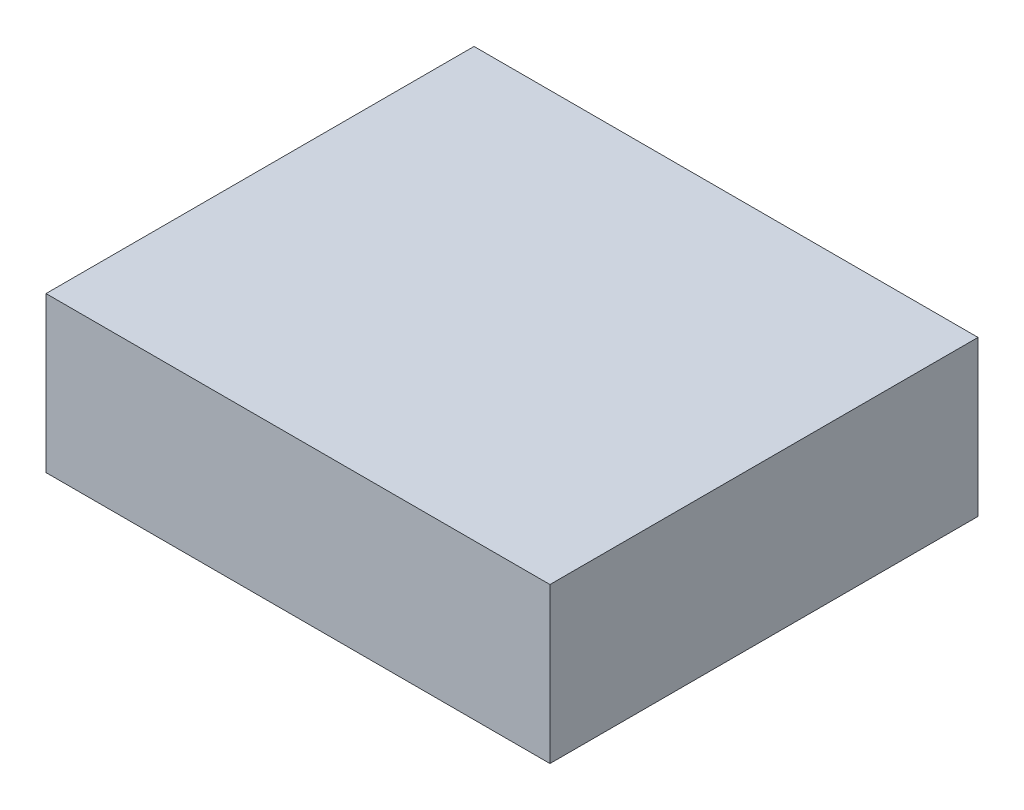
ISO-10303-21;
HEADER;
FILE_DESCRIPTION(('STEP AP214'),'2;1');
FILE_NAME('part.step','',(''),(''),'','','');
FILE_SCHEMA(('AUTOMOTIVE_DESIGN { 1 0 10303 214 1 1 1 1 }'));
ENDSEC;
DATA;
#1=APPLICATION_CONTEXT('core data for automotive mechanical design processes');
#2=APPLICATION_PROTOCOL_DEFINITION('international standard','automotive_design',2000,#1);
#3=PRODUCT_CONTEXT('',#1,'mechanical');
#4=PRODUCT('Part','Part','',(#3));
#5=PRODUCT_RELATED_PRODUCT_CATEGORY('part','',(#4));
#6=PRODUCT_DEFINITION_FORMATION('','',#4);
#7=PRODUCT_DEFINITION_CONTEXT('part definition',#1,'design');
#8=PRODUCT_DEFINITION('design','',#6,#7);
#9=PRODUCT_DEFINITION_SHAPE('','',#8);
#10=(LENGTH_UNIT() NAMED_UNIT(*) SI_UNIT(.MILLI.,.METRE.));
#11=(NAMED_UNIT(*) PLANE_ANGLE_UNIT() SI_UNIT($,.RADIAN.));
#12=(NAMED_UNIT(*) SI_UNIT($,.STERADIAN.) SOLID_ANGLE_UNIT());
#13=UNCERTAINTY_MEASURE_WITH_UNIT(LENGTH_MEASURE(1.E-05),#10,'distance_accuracy_value','');
#14=(GEOMETRIC_REPRESENTATION_CONTEXT(3) GLOBAL_UNCERTAINTY_ASSIGNED_CONTEXT((#13)) GLOBAL_UNIT_ASSIGNED_CONTEXT((#10,
#11,#12)) REPRESENTATION_CONTEXT('',''));
#15=CARTESIAN_POINT('',(0.,0.,0.));
#16=DIRECTION('',(0.,0.,1.));
#17=DIRECTION('',(1.,0.,0.));
#18=AXIS2_PLACEMENT_3D('',#15,#16,#17);
#19=CARTESIAN_POINT('',(156.,96.,132.5));
#20=DIRECTION('',(-1.,0.,0.));
#21=DIRECTION('',(0.,0.,1.));
#22=AXIS2_PLACEMENT_3D('',#19,#20,#21);
#23=PLANE('',#22);
#24=DIRECTION('',(0.,0.,-1.));
#25=VECTOR('',#24,1.);
#26=CARTESIAN_POINT('',(156.,0.,132.5));
#27=LINE('',#26,#25);
#28=CARTESIAN_POINT('',(156.,0.,132.5));
#29=VERTEX_POINT('',#28);
#30=CARTESIAN_POINT('',(156.,0.,-132.5));
#31=VERTEX_POINT('',#30);
#32=EDGE_CURVE('E101',#29,#31,#27,.T.);
#33=ORIENTED_EDGE('',*,*,#32,.T.);
#34=DIRECTION('',(0.,-1.,0.));
#35=VECTOR('',#34,1.);
#36=CARTESIAN_POINT('',(156.,96.,-132.5));
#37=LINE('',#36,#35);
#38=CARTESIAN_POINT('',(156.,96.,-132.5));
#39=VERTEX_POINT('',#38);
#40=EDGE_CURVE('E11',#39,#31,#37,.T.);
#41=ORIENTED_EDGE('',*,*,#40,.F.);
#42=DIRECTION('',(0.,0.,-1.));
#43=VECTOR('',#42,1.);
#44=CARTESIAN_POINT('',(156.,96.,132.5));
#45=LINE('',#44,#43);
#46=CARTESIAN_POINT('',(156.,96.,132.5));
#47=VERTEX_POINT('',#46);
#48=EDGE_CURVE('E89',#47,#39,#45,.T.);
#49=ORIENTED_EDGE('',*,*,#48,.F.);
#50=DIRECTION('',(0.,-1.,0.));
#51=VECTOR('',#50,1.);
#52=CARTESIAN_POINT('',(156.,96.,132.5));
#53=LINE('',#52,#51);
#54=EDGE_CURVE('E97',#47,#29,#53,.T.);
#55=ORIENTED_EDGE('',*,*,#54,.T.);
#56=EDGE_LOOP('',(#33,#41,#49,#55));
#57=FACE_BOUND('',#56,.T.);
#58=ADVANCED_FACE('F38',(#57),#23,.F.);
#59=CARTESIAN_POINT('',(-156.,96.,-132.5));
#60=DIRECTION('',(0.,0.,1.));
#61=DIRECTION('',(1.,0.,0.));
#62=AXIS2_PLACEMENT_3D('',#59,#60,#61);
#63=PLANE('',#62);
#64=DIRECTION('',(-1.,0.,0.));
#65=VECTOR('',#64,1.);
#66=CARTESIAN_POINT('',(-156.,0.,-132.5));
#67=LINE('',#66,#65);
#68=CARTESIAN_POINT('',(-156.,0.,-132.5));
#69=VERTEX_POINT('',#68);
#70=EDGE_CURVE('E93',#31,#69,#67,.T.);
#71=ORIENTED_EDGE('',*,*,#70,.T.);
#72=DIRECTION('',(0.,-1.,0.));
#73=VECTOR('',#72,1.);
#74=CARTESIAN_POINT('',(-156.,96.,-132.5));
#75=LINE('',#74,#73);
#76=CARTESIAN_POINT('',(-156.,96.,-132.5));
#77=VERTEX_POINT('',#76);
#78=EDGE_CURVE('E46',#77,#69,#75,.T.);
#79=ORIENTED_EDGE('',*,*,#78,.F.);
#80=DIRECTION('',(-1.,0.,0.));
#81=VECTOR('',#80,1.);
#82=CARTESIAN_POINT('',(-156.,96.,-132.5));
#83=LINE('',#82,#81);
#84=EDGE_CURVE('E84',#39,#77,#83,.T.);
#85=ORIENTED_EDGE('',*,*,#84,.F.);
#86=ORIENTED_EDGE('',*,*,#40,.T.);
#87=EDGE_LOOP('',(#71,#79,#85,#86));
#88=FACE_BOUND('',#87,.T.);
#89=ADVANCED_FACE('F92',(#88),#63,.F.);
#90=CARTESIAN_POINT('',(-156.,96.,132.5));
#91=DIRECTION('',(1.,0.,0.));
#92=DIRECTION('',(0.,0.,-1.));
#93=AXIS2_PLACEMENT_3D('',#90,#91,#92);
#94=PLANE('',#93);
#95=DIRECTION('',(0.,0.,1.));
#96=VECTOR('',#95,1.);
#97=CARTESIAN_POINT('',(-156.,0.,132.5));
#98=LINE('',#97,#96);
#99=CARTESIAN_POINT('',(-156.,0.,132.5));
#100=VERTEX_POINT('',#99);
#101=EDGE_CURVE('E71',#69,#100,#98,.T.);
#102=ORIENTED_EDGE('',*,*,#101,.T.);
#103=DIRECTION('',(0.,-1.,0.));
#104=VECTOR('',#103,1.);
#105=CARTESIAN_POINT('',(-156.,96.,132.5));
#106=LINE('',#105,#104);
#107=CARTESIAN_POINT('',(-156.,96.,132.5));
#108=VERTEX_POINT('',#107);
#109=EDGE_CURVE('E94',#108,#100,#106,.T.);
#110=ORIENTED_EDGE('',*,*,#109,.F.);
#111=DIRECTION('',(0.,0.,1.));
#112=VECTOR('',#111,1.);
#113=CARTESIAN_POINT('',(-156.,96.,132.5));
#114=LINE('',#113,#112);
#115=EDGE_CURVE('E87',#77,#108,#114,.T.);
#116=ORIENTED_EDGE('',*,*,#115,.F.);
#117=ORIENTED_EDGE('',*,*,#78,.T.);
#118=EDGE_LOOP('',(#102,#110,#116,#117));
#119=FACE_BOUND('',#118,.T.);
#120=ADVANCED_FACE('F95',(#119),#94,.F.);
#121=CARTESIAN_POINT('',(-156.,96.,132.5));
#122=DIRECTION('',(0.,0.,-1.));
#123=DIRECTION('',(-1.,0.,0.));
#124=AXIS2_PLACEMENT_3D('',#121,#122,#123);
#125=PLANE('',#124);
#126=DIRECTION('',(1.,0.,0.));
#127=VECTOR('',#126,1.);
#128=CARTESIAN_POINT('',(-156.,0.,132.5));
#129=LINE('',#128,#127);
#130=EDGE_CURVE('E77',#100,#29,#129,.T.);
#131=ORIENTED_EDGE('',*,*,#130,.T.);
#132=ORIENTED_EDGE('',*,*,#54,.F.);
#133=DIRECTION('',(1.,0.,0.));
#134=VECTOR('',#133,1.);
#135=CARTESIAN_POINT('',(-156.,96.,132.5));
#136=LINE('',#135,#134);
#137=EDGE_CURVE('E54',#108,#47,#136,.T.);
#138=ORIENTED_EDGE('',*,*,#137,.F.);
#139=ORIENTED_EDGE('',*,*,#109,.T.);
#140=EDGE_LOOP('',(#131,#132,#138,#139));
#141=FACE_BOUND('',#140,.T.);
#142=ADVANCED_FACE('F108',(#141),#125,.F.);
#143=CARTESIAN_POINT('',(0.,96.,0.));
#144=DIRECTION('',(0.,-1.,0.));
#145=DIRECTION('',(0.,0.,-1.));
#146=AXIS2_PLACEMENT_3D('',#143,#144,#145);
#147=PLANE('',#146);
#148=ORIENTED_EDGE('',*,*,#48,.T.);
#149=ORIENTED_EDGE('',*,*,#84,.T.);
#150=ORIENTED_EDGE('',*,*,#115,.T.);
#151=ORIENTED_EDGE('',*,*,#137,.T.);
#152=EDGE_LOOP('',(#148,#149,#150,#151));
#153=FACE_BOUND('',#152,.T.);
#154=ADVANCED_FACE('F85',(#153),#147,.F.);
#155=CARTESIAN_POINT('',(0.,0.,0.));
#156=DIRECTION('',(0.,-1.,0.));
#157=DIRECTION('',(0.,0.,-1.));
#158=AXIS2_PLACEMENT_3D('',#155,#156,#157);
#159=PLANE('',#158);
#160=ORIENTED_EDGE('',*,*,#32,.F.);
#161=ORIENTED_EDGE('',*,*,#130,.F.);
#162=ORIENTED_EDGE('',*,*,#101,.F.);
#163=ORIENTED_EDGE('',*,*,#70,.F.);
#164=EDGE_LOOP('',(#160,#161,#162,#163));
#165=FACE_BOUND('',#164,.T.);
#166=ADVANCED_FACE('F111',(#165),#159,.T.);
#167=CLOSED_SHELL('',(#58,#89,#120,#142,#154,#166));
#168=MANIFOLD_SOLID_BREP('B2',#167);
#169=ADVANCED_BREP_SHAPE_REPRESENTATION('',(#18,#168),#14);
#170=SHAPE_DEFINITION_REPRESENTATION(#9,#169);
ENDSEC;
END-ISO-10303-21;
